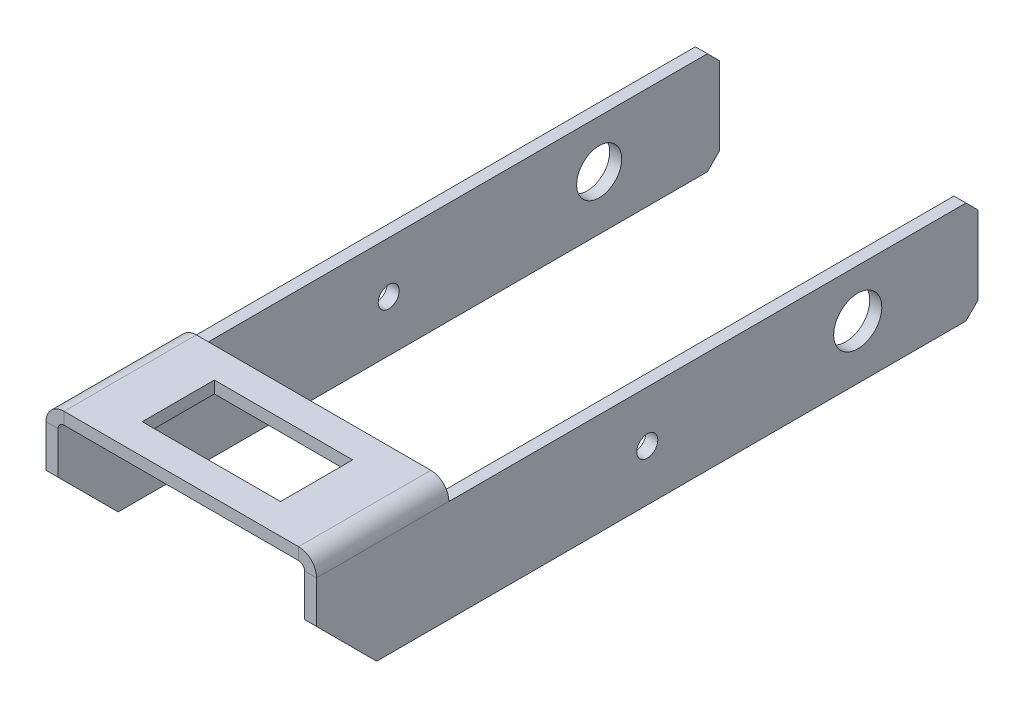
ISO-10303-21;
HEADER;
FILE_DESCRIPTION(('STEP AP214'),'2;1');
FILE_NAME('part.step','',(''),(''),'','','');
FILE_SCHEMA(('AUTOMOTIVE_DESIGN { 1 0 10303 214 1 1 1 1 }'));
ENDSEC;
DATA;
#1=APPLICATION_CONTEXT('core data for automotive mechanical design processes');
#2=APPLICATION_PROTOCOL_DEFINITION('international standard','automotive_design',2000,#1);
#3=PRODUCT_CONTEXT('',#1,'mechanical');
#4=PRODUCT('Part','Part','',(#3));
#5=PRODUCT_RELATED_PRODUCT_CATEGORY('part','',(#4));
#6=PRODUCT_DEFINITION_FORMATION('','',#4);
#7=PRODUCT_DEFINITION_CONTEXT('part definition',#1,'design');
#8=PRODUCT_DEFINITION('design','',#6,#7);
#9=PRODUCT_DEFINITION_SHAPE('','',#8);
#10=(LENGTH_UNIT() NAMED_UNIT(*) SI_UNIT(.MILLI.,.METRE.));
#11=(NAMED_UNIT(*) PLANE_ANGLE_UNIT() SI_UNIT($,.RADIAN.));
#12=(NAMED_UNIT(*) SI_UNIT($,.STERADIAN.) SOLID_ANGLE_UNIT());
#13=UNCERTAINTY_MEASURE_WITH_UNIT(LENGTH_MEASURE(1.E-05),#10,'distance_accuracy_value','');
#14=(GEOMETRIC_REPRESENTATION_CONTEXT(3) GLOBAL_UNCERTAINTY_ASSIGNED_CONTEXT((#13)) GLOBAL_UNIT_ASSIGNED_CONTEXT((#10,
#11,#12)) REPRESENTATION_CONTEXT('',''));
#15=CARTESIAN_POINT('',(0.,0.,0.));
#16=DIRECTION('',(0.,0.,1.));
#17=DIRECTION('',(1.,0.,0.));
#18=AXIS2_PLACEMENT_3D('',#15,#16,#17);
#19=CARTESIAN_POINT('',(0.,2.,0.));
#20=DIRECTION('',(0.,0.,-1.));
#21=DIRECTION('',(-1.,0.,0.));
#22=AXIS2_PLACEMENT_3D('',#19,#20,#21);
#23=PLANE('',#22);
#24=DIRECTION('',(0.,1.,0.));
#25=VECTOR('',#24,1.);
#26=CARTESIAN_POINT('',(3.,0.,0.));
#27=LINE('',#26,#25);
#28=CARTESIAN_POINT('',(3.,0.,0.));
#29=VERTEX_POINT('',#28);
#30=CARTESIAN_POINT('',(3.,2.,0.));
#31=VERTEX_POINT('',#30);
#32=EDGE_CURVE('E338',#29,#31,#27,.T.);
#33=ORIENTED_EDGE('',*,*,#32,.F.);
#34=DIRECTION('',(1.,0.,0.));
#35=VECTOR('',#34,1.);
#36=CARTESIAN_POINT('',(0.,0.,0.));
#37=LINE('',#36,#35);
#38=CARTESIAN_POINT('',(42.,0.,0.));
#39=VERTEX_POINT('',#38);
#40=EDGE_CURVE('E395',#29,#39,#37,.T.);
#41=ORIENTED_EDGE('',*,*,#40,.T.);
#42=DIRECTION('',(0.,1.,0.));
#43=VECTOR('',#42,1.);
#44=CARTESIAN_POINT('',(42.,0.,0.));
#45=LINE('',#44,#43);
#46=CARTESIAN_POINT('',(42.,2.,0.));
#47=VERTEX_POINT('',#46);
#48=EDGE_CURVE('E376',#39,#47,#45,.T.);
#49=ORIENTED_EDGE('',*,*,#48,.T.);
#50=DIRECTION('',(1.,0.,0.));
#51=VECTOR('',#50,1.);
#52=CARTESIAN_POINT('',(0.,2.,0.));
#53=LINE('',#52,#51);
#54=EDGE_CURVE('E397',#31,#47,#53,.T.);
#55=ORIENTED_EDGE('',*,*,#54,.F.);
#56=EDGE_LOOP('',(#33,#41,#49,#55));
#57=FACE_BOUND('',#56,.T.);
#58=ADVANCED_FACE('F79',(#57),#23,.F.);
#59=CARTESIAN_POINT('',(0.,2.,-22.));
#60=DIRECTION('',(0.,0.,1.));
#61=DIRECTION('',(1.,0.,0.));
#62=AXIS2_PLACEMENT_3D('',#59,#60,#61);
#63=PLANE('',#62);
#64=DIRECTION('',(0.,1.,0.));
#65=VECTOR('',#64,1.);
#66=CARTESIAN_POINT('',(3.,0.,-22.));
#67=LINE('',#66,#65);
#68=CARTESIAN_POINT('',(3.,0.,-22.));
#69=VERTEX_POINT('',#68);
#70=CARTESIAN_POINT('',(3.,2.,-22.));
#71=VERTEX_POINT('',#70);
#72=EDGE_CURVE('E324',#69,#71,#67,.T.);
#73=ORIENTED_EDGE('',*,*,#72,.T.);
#74=DIRECTION('',(-1.,0.,0.));
#75=VECTOR('',#74,1.);
#76=CARTESIAN_POINT('',(0.,2.,-22.));
#77=LINE('',#76,#75);
#78=CARTESIAN_POINT('',(42.,2.,-22.));
#79=VERTEX_POINT('',#78);
#80=EDGE_CURVE('E400',#79,#71,#77,.T.);
#81=ORIENTED_EDGE('',*,*,#80,.F.);
#82=DIRECTION('',(0.,1.,0.));
#83=VECTOR('',#82,1.);
#84=CARTESIAN_POINT('',(42.,0.,-22.));
#85=LINE('',#84,#83);
#86=CARTESIAN_POINT('',(42.,0.,-22.));
#87=VERTEX_POINT('',#86);
#88=EDGE_CURVE('E389',#87,#79,#85,.T.);
#89=ORIENTED_EDGE('',*,*,#88,.F.);
#90=DIRECTION('',(-1.,0.,0.));
#91=VECTOR('',#90,1.);
#92=CARTESIAN_POINT('',(0.,0.,-22.));
#93=LINE('',#92,#91);
#94=EDGE_CURVE('E401',#87,#69,#93,.T.);
#95=ORIENTED_EDGE('',*,*,#94,.T.);
#96=EDGE_LOOP('',(#73,#81,#89,#95));
#97=FACE_BOUND('',#96,.T.);
#98=ADVANCED_FACE('F495',(#97),#63,.F.);
#99=CARTESIAN_POINT('',(0.,2.,0.));
#100=DIRECTION('',(0.,-1.,0.));
#101=DIRECTION('',(0.,0.,-1.));
#102=AXIS2_PLACEMENT_3D('',#99,#100,#101);
#103=PLANE('',#102);
#104=DIRECTION('',(-1.,0.,0.));
#105=VECTOR('',#104,1.);
#106=CARTESIAN_POINT('',(11.,2.,-17.));
#107=LINE('',#106,#105);
#108=CARTESIAN_POINT('',(34.,2.,-17.));
#109=VERTEX_POINT('',#108);
#110=CARTESIAN_POINT('',(11.,2.,-17.));
#111=VERTEX_POINT('',#110);
#112=EDGE_CURVE('E257',#109,#111,#107,.T.);
#113=ORIENTED_EDGE('',*,*,#112,.F.);
#114=DIRECTION('',(0.,0.,-1.));
#115=VECTOR('',#114,1.);
#116=CARTESIAN_POINT('',(34.,2.,-5.));
#117=LINE('',#116,#115);
#118=CARTESIAN_POINT('',(34.,2.,-5.));
#119=VERTEX_POINT('',#118);
#120=EDGE_CURVE('E262',#119,#109,#117,.T.);
#121=ORIENTED_EDGE('',*,*,#120,.F.);
#122=DIRECTION('',(1.,0.,0.));
#123=VECTOR('',#122,1.);
#124=CARTESIAN_POINT('',(11.,2.,-5.));
#125=LINE('',#124,#123);
#126=CARTESIAN_POINT('',(11.,2.,-5.));
#127=VERTEX_POINT('',#126);
#128=EDGE_CURVE('E267',#127,#119,#125,.T.);
#129=ORIENTED_EDGE('',*,*,#128,.F.);
#130=DIRECTION('',(0.,0.,1.));
#131=VECTOR('',#130,1.);
#132=CARTESIAN_POINT('',(11.,2.,-5.));
#133=LINE('',#132,#131);
#134=EDGE_CURVE('E246',#111,#127,#133,.T.);
#135=ORIENTED_EDGE('',*,*,#134,.F.);
#136=EDGE_LOOP('',(#113,#121,#129,#135));
#137=FACE_BOUND('',#136,.T.);
#138=DIRECTION('',(0.,0.,-1.));
#139=VECTOR('',#138,1.);
#140=CARTESIAN_POINT('',(3.,2.,-22.));
#141=LINE('',#140,#139);
#142=EDGE_CURVE('E318',#71,#31,#141,.F.);
#143=ORIENTED_EDGE('',*,*,#142,.T.);
#144=ORIENTED_EDGE('',*,*,#54,.T.);
#145=DIRECTION('',(0.,0.,1.));
#146=VECTOR('',#145,1.);
#147=CARTESIAN_POINT('',(42.,2.,0.));
#148=LINE('',#147,#146);
#149=EDGE_CURVE('E371',#47,#79,#148,.F.);
#150=ORIENTED_EDGE('',*,*,#149,.T.);
#151=ORIENTED_EDGE('',*,*,#80,.T.);
#152=EDGE_LOOP('',(#143,#144,#150,#151));
#153=FACE_BOUND('',#152,.T.);
#154=ADVANCED_FACE('F264',(#137,#153),#103,.F.);
#155=CARTESIAN_POINT('',(0.,0.,0.));
#156=DIRECTION('',(0.,-1.,0.));
#157=DIRECTION('',(0.,0.,-1.));
#158=AXIS2_PLACEMENT_3D('',#155,#156,#157);
#159=PLANE('',#158);
#160=DIRECTION('',(0.,0.,1.));
#161=VECTOR('',#160,1.);
#162=CARTESIAN_POINT('',(34.,0.,0.));
#163=LINE('',#162,#161);
#164=CARTESIAN_POINT('',(34.,0.,-17.));
#165=VERTEX_POINT('',#164);
#166=CARTESIAN_POINT('',(34.,0.,-5.));
#167=VERTEX_POINT('',#166);
#168=EDGE_CURVE('E417',#165,#167,#163,.T.);
#169=ORIENTED_EDGE('',*,*,#168,.F.);
#170=DIRECTION('',(1.,0.,0.));
#171=VECTOR('',#170,1.);
#172=CARTESIAN_POINT('',(0.,0.,-17.));
#173=LINE('',#172,#171);
#174=CARTESIAN_POINT('',(11.,0.,-17.));
#175=VERTEX_POINT('',#174);
#176=EDGE_CURVE('E403',#175,#165,#173,.T.);
#177=ORIENTED_EDGE('',*,*,#176,.F.);
#178=DIRECTION('',(0.,0.,-1.));
#179=VECTOR('',#178,1.);
#180=CARTESIAN_POINT('',(11.,0.,0.));
#181=LINE('',#180,#179);
#182=CARTESIAN_POINT('',(11.,0.,-5.));
#183=VERTEX_POINT('',#182);
#184=EDGE_CURVE('E249',#183,#175,#181,.T.);
#185=ORIENTED_EDGE('',*,*,#184,.F.);
#186=DIRECTION('',(-1.,0.,0.));
#187=VECTOR('',#186,1.);
#188=CARTESIAN_POINT('',(0.,0.,-5.));
#189=LINE('',#188,#187);
#190=EDGE_CURVE('E415',#167,#183,#189,.T.);
#191=ORIENTED_EDGE('',*,*,#190,.F.);
#192=EDGE_LOOP('',(#169,#177,#185,#191));
#193=FACE_BOUND('',#192,.T.);
#194=ORIENTED_EDGE('',*,*,#40,.F.);
#195=DIRECTION('',(0.,0.,-1.));
#196=VECTOR('',#195,1.);
#197=CARTESIAN_POINT('',(3.,0.,-22.));
#198=LINE('',#197,#196);
#199=EDGE_CURVE('E333',#69,#29,#198,.F.);
#200=ORIENTED_EDGE('',*,*,#199,.F.);
#201=ORIENTED_EDGE('',*,*,#94,.F.);
#202=DIRECTION('',(0.,0.,1.));
#203=VECTOR('',#202,1.);
#204=CARTESIAN_POINT('',(42.,0.,0.));
#205=LINE('',#204,#203);
#206=EDGE_CURVE('E382',#39,#87,#205,.F.);
#207=ORIENTED_EDGE('',*,*,#206,.F.);
#208=EDGE_LOOP('',(#194,#200,#201,#207));
#209=FACE_BOUND('',#208,.T.);
#210=ADVANCED_FACE('F491',(#193,#209),#159,.T.);
#211=CARTESIAN_POINT('',(42.,-0.999999999999994,-22.));
#212=DIRECTION('',(0.,0.,-1.));
#213=DIRECTION('',(0.,1.,0.));
#214=AXIS2_PLACEMENT_3D('',#211,#212,#213);
#215=PLANE('',#214);
#216=DIRECTION('',(1.,0.,0.));
#217=VECTOR('',#216,1.);
#218=CARTESIAN_POINT('',(43.,-0.999999999999991,-22.));
#219=LINE('',#218,#217);
#220=CARTESIAN_POINT('',(43.,-0.999999999999991,-22.));
#221=VERTEX_POINT('',#220);
#222=CARTESIAN_POINT('',(45.,-0.999999999999983,-22.));
#223=VERTEX_POINT('',#222);
#224=EDGE_CURVE('E392',#221,#223,#219,.T.);
#225=ORIENTED_EDGE('',*,*,#224,.F.);
#226=CARTESIAN_POINT('',(42.,-0.999999999999994,-22.));
#227=DIRECTION('',(0.,0.,1.));
#228=DIRECTION('',(0.,-1.,0.));
#229=AXIS2_PLACEMENT_3D('',#226,#227,#228);
#230=CIRCLE('',#229,1.);
#231=EDGE_CURVE('E379',#87,#221,#230,.F.);
#232=ORIENTED_EDGE('',*,*,#231,.F.);
#233=ORIENTED_EDGE('',*,*,#88,.T.);
#234=CARTESIAN_POINT('',(42.,-0.999999999999994,-22.));
#235=DIRECTION('',(0.,0.,1.));
#236=DIRECTION('',(0.,-1.,0.));
#237=AXIS2_PLACEMENT_3D('',#234,#235,#236);
#238=CIRCLE('',#237,3.);
#239=EDGE_CURVE('E373',#79,#223,#238,.F.);
#240=ORIENTED_EDGE('',*,*,#239,.T.);
#241=EDGE_LOOP('',(#225,#232,#233,#240));
#242=FACE_BOUND('',#241,.T.);
#243=ADVANCED_FACE('F555',(#242),#215,.T.);
#244=CARTESIAN_POINT('',(42.,-0.999999999999999,0.));
#245=DIRECTION('',(0.,0.,-1.));
#246=DIRECTION('',(0.,1.,0.));
#247=AXIS2_PLACEMENT_3D('',#244,#245,#246);
#248=PLANE('',#247);
#249=CARTESIAN_POINT('',(42.,-0.999999999999999,0.));
#250=DIRECTION('',(0.,0.,1.));
#251=DIRECTION('',(0.,-1.,0.));
#252=AXIS2_PLACEMENT_3D('',#249,#250,#251);
#253=CIRCLE('',#252,1.);
#254=CARTESIAN_POINT('',(43.,-0.999999999999995,0.));
#255=VERTEX_POINT('',#254);
#256=EDGE_CURVE('E385',#255,#39,#253,.T.);
#257=ORIENTED_EDGE('',*,*,#256,.F.);
#258=DIRECTION('',(-1.,0.,0.));
#259=VECTOR('',#258,1.);
#260=CARTESIAN_POINT('',(43.,-0.999999999999994,0.));
#261=LINE('',#260,#259);
#262=CARTESIAN_POINT('',(45.,-0.999999999999989,0.));
#263=VERTEX_POINT('',#262);
#264=EDGE_CURVE('E368',#255,#263,#261,.F.);
#265=ORIENTED_EDGE('',*,*,#264,.T.);
#266=CARTESIAN_POINT('',(42.,-0.999999999999999,0.));
#267=DIRECTION('',(0.,0.,1.));
#268=DIRECTION('',(0.,-1.,0.));
#269=AXIS2_PLACEMENT_3D('',#266,#267,#268);
#270=CIRCLE('',#269,3.);
#271=EDGE_CURVE('E374',#263,#47,#270,.T.);
#272=ORIENTED_EDGE('',*,*,#271,.T.);
#273=ORIENTED_EDGE('',*,*,#48,.F.);
#274=EDGE_LOOP('',(#257,#265,#272,#273));
#275=FACE_BOUND('',#274,.T.);
#276=ADVANCED_FACE('F509',(#275),#248,.F.);
#277=CARTESIAN_POINT('',(42.,-0.999999999999999,0.));
#278=DIRECTION('',(0.,0.,1.));
#279=DIRECTION('',(1.,0.,0.));
#280=AXIS2_PLACEMENT_3D('',#277,#278,#279);
#281=CYLINDRICAL_SURFACE('',#280,3.);
#282=ORIENTED_EDGE('',*,*,#149,.F.);
#283=ORIENTED_EDGE('',*,*,#271,.F.);
#284=DIRECTION('',(0.,0.,1.));
#285=VECTOR('',#284,1.);
#286=CARTESIAN_POINT('',(45.,-0.999999999999966,-110.));
#287=LINE('',#286,#285);
#288=EDGE_CURVE('E364',#263,#223,#287,.F.);
#289=ORIENTED_EDGE('',*,*,#288,.T.);
#290=ORIENTED_EDGE('',*,*,#239,.F.);
#291=EDGE_LOOP('',(#282,#283,#289,#290));
#292=FACE_BOUND('',#291,.T.);
#293=ADVANCED_FACE('F558',(#292),#281,.T.);
#294=CARTESIAN_POINT('',(42.,-0.999999999999999,0.));
#295=DIRECTION('',(0.,0.,1.));
#296=DIRECTION('',(1.,0.,0.));
#297=AXIS2_PLACEMENT_3D('',#294,#295,#296);
#298=CYLINDRICAL_SURFACE('',#297,1.);
#299=ORIENTED_EDGE('',*,*,#206,.T.);
#300=ORIENTED_EDGE('',*,*,#231,.T.);
#301=DIRECTION('',(0.,0.,1.));
#302=VECTOR('',#301,1.);
#303=CARTESIAN_POINT('',(43.,-0.999999999999995,0.));
#304=LINE('',#303,#302);
#305=EDGE_CURVE('E350',#221,#255,#304,.T.);
#306=ORIENTED_EDGE('',*,*,#305,.T.);
#307=ORIENTED_EDGE('',*,*,#256,.T.);
#308=EDGE_LOOP('',(#299,#300,#306,#307));
#309=FACE_BOUND('',#308,.T.);
#310=ADVANCED_FACE('F513',(#309),#298,.F.);
#311=CARTESIAN_POINT('',(45.0000000000001,-18.,0.));
#312=DIRECTION('',(0.,0.,-1.));
#313=DIRECTION('',(-1.,0.,0.));
#314=AXIS2_PLACEMENT_3D('',#311,#312,#313);
#315=PLANE('',#314);
#316=DIRECTION('',(0.,1.,0.));
#317=VECTOR('',#316,1.);
#318=CARTESIAN_POINT('',(43.0000000000001,-18.,0.));
#319=LINE('',#318,#317);
#320=CARTESIAN_POINT('',(43.,-7.99999999999997,0.));
#321=VERTEX_POINT('',#320);
#322=EDGE_CURVE('E361',#255,#321,#319,.F.);
#323=ORIENTED_EDGE('',*,*,#322,.T.);
#324=DIRECTION('',(1.,0.,0.));
#325=VECTOR('',#324,1.);
#326=CARTESIAN_POINT('',(45.,-7.99999999999996,0.));
#327=LINE('',#326,#325);
#328=CARTESIAN_POINT('',(45.,-7.99999999999996,0.));
#329=VERTEX_POINT('',#328);
#330=EDGE_CURVE('E462',#321,#329,#327,.T.);
#331=ORIENTED_EDGE('',*,*,#330,.T.);
#332=DIRECTION('',(0.,-1.,0.));
#333=VECTOR('',#332,1.);
#334=CARTESIAN_POINT('',(45.,1.63108075515599E-13,0.));
#335=LINE('',#334,#333);
#336=EDGE_CURVE('E353',#263,#329,#335,.T.);
#337=ORIENTED_EDGE('',*,*,#336,.F.);
#338=ORIENTED_EDGE('',*,*,#264,.F.);
#339=EDGE_LOOP('',(#323,#331,#337,#338));
#340=FACE_BOUND('',#339,.T.);
#341=ADVANCED_FACE('F524',(#340),#315,.F.);
#342=CARTESIAN_POINT('',(45.,0.,-110.));
#343=DIRECTION('',(0.,0.,1.));
#344=DIRECTION('',(1.,0.,0.));
#345=AXIS2_PLACEMENT_3D('',#342,#343,#344);
#346=PLANE('',#345);
#347=DIRECTION('',(0.,1.,0.));
#348=VECTOR('',#347,1.);
#349=CARTESIAN_POINT('',(45.,1.63108075515599E-13,-110.));
#350=LINE('',#349,#348);
#351=CARTESIAN_POINT('',(45.0000000000001,-16.,-110.));
#352=VERTEX_POINT('',#351);
#353=CARTESIAN_POINT('',(45.,-2.99999999999995,-110.));
#354=VERTEX_POINT('',#353);
#355=EDGE_CURVE('E347',#352,#354,#350,.T.);
#356=ORIENTED_EDGE('',*,*,#355,.F.);
#357=DIRECTION('',(-1.,0.,0.));
#358=VECTOR('',#357,1.);
#359=CARTESIAN_POINT('',(45.0000000000001,-16.,-110.));
#360=LINE('',#359,#358);
#361=CARTESIAN_POINT('',(43.,-16.,-110.));
#362=VERTEX_POINT('',#361);
#363=EDGE_CURVE('E440',#352,#362,#360,.T.);
#364=ORIENTED_EDGE('',*,*,#363,.T.);
#365=DIRECTION('',(0.,-1.,0.));
#366=VECTOR('',#365,1.);
#367=CARTESIAN_POINT('',(43.,0.,-110.));
#368=LINE('',#367,#366);
#369=CARTESIAN_POINT('',(43.,-2.99999999999996,-110.));
#370=VERTEX_POINT('',#369);
#371=EDGE_CURVE('E356',#362,#370,#368,.F.);
#372=ORIENTED_EDGE('',*,*,#371,.T.);
#373=DIRECTION('',(1.,0.,0.));
#374=VECTOR('',#373,1.);
#375=CARTESIAN_POINT('',(45.,-2.99999999999995,-110.));
#376=LINE('',#375,#374);
#377=EDGE_CURVE('E437',#370,#354,#376,.T.);
#378=ORIENTED_EDGE('',*,*,#377,.T.);
#379=EDGE_LOOP('',(#356,#364,#372,#378));
#380=FACE_BOUND('',#379,.T.);
#381=ADVANCED_FACE('F543',(#380),#346,.F.);
#382=CARTESIAN_POINT('',(45.,1.63108075515599E-13,0.));
#383=DIRECTION('',(-1.,0.,0.));
#384=DIRECTION('',(0.,-1.,0.));
#385=AXIS2_PLACEMENT_3D('',#382,#383,#384);
#386=PLANE('',#385);
#387=CARTESIAN_POINT('',(45.0000000000001,-9.50000000000017,-55.));
#388=DIRECTION('',(-1.,0.,0.));
#389=DIRECTION('',(0.,-1.,0.));
#390=AXIS2_PLACEMENT_3D('',#387,#388,#389);
#391=CIRCLE('',#390,1.75);
#392=CARTESIAN_POINT('',(45.0000000000001,-11.2500000000002,-55.));
#393=VERTEX_POINT('',#392);
#394=EDGE_CURVE('E277',#393,#393,#391,.T.);
#395=ORIENTED_EDGE('',*,*,#394,.T.);
#396=EDGE_LOOP('',(#395));
#397=FACE_BOUND('',#396,.T.);
#398=CARTESIAN_POINT('',(45.,-8.99999999999984,-90.));
#399=DIRECTION('',(1.,0.,0.));
#400=DIRECTION('',(0.,1.,0.));
#401=AXIS2_PLACEMENT_3D('',#398,#399,#400);
#402=CIRCLE('',#401,4.00000000000001);
#403=CARTESIAN_POINT('',(45.,-4.99999999999984,-90.));
#404=VERTEX_POINT('',#403);
#405=EDGE_CURVE('E290',#404,#404,#402,.T.);
#406=ORIENTED_EDGE('',*,*,#405,.F.);
#407=EDGE_LOOP('',(#406));
#408=FACE_BOUND('',#407,.T.);
#409=ORIENTED_EDGE('',*,*,#336,.T.);
#410=DIRECTION('',(0.,0.707106781186549,0.707106781186546));
#411=VECTOR('',#410,1.);
#412=CARTESIAN_POINT('',(45.0000000000001,-18.,-10.));
#413=LINE('',#412,#411);
#414=CARTESIAN_POINT('',(45.0000000000001,-18.,-10.));
#415=VERTEX_POINT('',#414);
#416=EDGE_CURVE('E464',#329,#415,#413,.F.);
#417=ORIENTED_EDGE('',*,*,#416,.T.);
#418=DIRECTION('',(0.,0.,-1.));
#419=VECTOR('',#418,1.);
#420=CARTESIAN_POINT('',(45.0000000000001,-18.,0.));
#421=LINE('',#420,#419);
#422=CARTESIAN_POINT('',(45.0000000000001,-18.,-108.));
#423=VERTEX_POINT('',#422);
#424=EDGE_CURVE('E351',#415,#423,#421,.T.);
#425=ORIENTED_EDGE('',*,*,#424,.T.);
#426=DIRECTION('',(0.,-0.707106781186545,0.70710678118655));
#427=VECTOR('',#426,1.);
#428=CARTESIAN_POINT('',(45.0000000000001,-16.,-110.));
#429=LINE('',#428,#427);
#430=EDGE_CURVE('E453',#423,#352,#429,.F.);
#431=ORIENTED_EDGE('',*,*,#430,.T.);
#432=ORIENTED_EDGE('',*,*,#355,.T.);
#433=DIRECTION('',(0.,0.707106781186545,0.70710678118655));
#434=VECTOR('',#433,1.);
#435=CARTESIAN_POINT('',(45.,-2.99999999999995,-110.));
#436=LINE('',#435,#434);
#437=CARTESIAN_POINT('',(45.,-0.999999999999967,-108.));
#438=VERTEX_POINT('',#437);
#439=EDGE_CURVE('E451',#354,#438,#436,.T.);
#440=ORIENTED_EDGE('',*,*,#439,.T.);
#441=EDGE_CURVE('E367',#223,#438,#287,.F.);
#442=ORIENTED_EDGE('',*,*,#441,.F.);
#443=ORIENTED_EDGE('',*,*,#288,.F.);
#444=EDGE_LOOP('',(#409,#417,#425,#431,#432,#440,#442,#443));
#445=FACE_BOUND('',#444,.T.);
#446=ADVANCED_FACE('F532',(#397,#408,#445),#386,.F.);
#447=CARTESIAN_POINT('',(43.,1.56125112837912E-13,0.));
#448=DIRECTION('',(-1.,0.,0.));
#449=DIRECTION('',(0.,-1.,0.));
#450=AXIS2_PLACEMENT_3D('',#447,#448,#449);
#451=PLANE('',#450);
#452=CARTESIAN_POINT('',(43.,-9.50000000000016,-55.));
#453=DIRECTION('',(-1.,0.,0.));
#454=DIRECTION('',(0.,-1.,0.));
#455=AXIS2_PLACEMENT_3D('',#452,#453,#454);
#456=CIRCLE('',#455,1.75);
#457=CARTESIAN_POINT('',(43.,-11.2500000000002,-55.));
#458=VERTEX_POINT('',#457);
#459=EDGE_CURVE('E283',#458,#458,#456,.T.);
#460=ORIENTED_EDGE('',*,*,#459,.F.);
#461=EDGE_LOOP('',(#460));
#462=FACE_BOUND('',#461,.T.);
#463=CARTESIAN_POINT('',(43.,-8.99999999999985,-90.));
#464=DIRECTION('',(-1.,0.,0.));
#465=DIRECTION('',(0.,-1.,0.));
#466=AXIS2_PLACEMENT_3D('',#463,#464,#465);
#467=CIRCLE('',#466,4.00000000000001);
#468=CARTESIAN_POINT('',(43.,-12.9999999999999,-90.));
#469=VERTEX_POINT('',#468);
#470=EDGE_CURVE('E293',#469,#469,#467,.T.);
#471=ORIENTED_EDGE('',*,*,#470,.F.);
#472=EDGE_LOOP('',(#471));
#473=FACE_BOUND('',#472,.T.);
#474=DIRECTION('',(0.,0.,1.));
#475=VECTOR('',#474,1.);
#476=CARTESIAN_POINT('',(43.0000000000001,-18.,-110.));
#477=LINE('',#476,#475);
#478=CARTESIAN_POINT('',(43.0000000000001,-18.,-10.));
#479=VERTEX_POINT('',#478);
#480=CARTESIAN_POINT('',(43.0000000000001,-18.,-108.));
#481=VERTEX_POINT('',#480);
#482=EDGE_CURVE('E359',#479,#481,#477,.F.);
#483=ORIENTED_EDGE('',*,*,#482,.F.);
#484=DIRECTION('',(0.,-0.707106781186549,-0.707106781186546));
#485=VECTOR('',#484,1.);
#486=CARTESIAN_POINT('',(43.,-3.99999999999989,4.00000000000006));
#487=LINE('',#486,#485);
#488=EDGE_CURVE('E460',#479,#321,#487,.F.);
#489=ORIENTED_EDGE('',*,*,#488,.T.);
#490=ORIENTED_EDGE('',*,*,#322,.F.);
#491=ORIENTED_EDGE('',*,*,#305,.F.);
#492=DIRECTION('',(0.,0.,1.));
#493=VECTOR('',#492,1.);
#494=CARTESIAN_POINT('',(43.,-0.999999999999973,-110.));
#495=LINE('',#494,#493);
#496=CARTESIAN_POINT('',(43.,-0.999999999999974,-108.));
#497=VERTEX_POINT('',#496);
#498=EDGE_CURVE('E344',#497,#221,#495,.T.);
#499=ORIENTED_EDGE('',*,*,#498,.F.);
#500=DIRECTION('',(0.,-0.707106781186545,-0.70710678118655));
#501=VECTOR('',#500,1.);
#502=CARTESIAN_POINT('',(42.9999999999998,53.5000000000001,-53.4999999999996));
#503=LINE('',#502,#501);
#504=EDGE_CURVE('E443',#497,#370,#503,.T.);
#505=ORIENTED_EDGE('',*,*,#504,.T.);
#506=ORIENTED_EDGE('',*,*,#371,.F.);
#507=DIRECTION('',(0.,0.707106781186545,-0.70710678118655));
#508=VECTOR('',#507,1.);
#509=CARTESIAN_POINT('',(43.0000000000002,-63.,-62.9999999999997));
#510=LINE('',#509,#508);
#511=EDGE_CURVE('E445',#362,#481,#510,.F.);
#512=ORIENTED_EDGE('',*,*,#511,.T.);
#513=EDGE_LOOP('',(#483,#489,#490,#491,#499,#505,#506,#512));
#514=FACE_BOUND('',#513,.T.);
#515=ADVANCED_FACE('F520',(#462,#473,#514),#451,.T.);
#516=CARTESIAN_POINT('',(45.0000000000001,-18.,-110.));
#517=DIRECTION('',(0.,1.,0.));
#518=DIRECTION('',(-1.,0.,0.));
#519=AXIS2_PLACEMENT_3D('',#516,#517,#518);
#520=PLANE('',#519);
#521=ORIENTED_EDGE('',*,*,#424,.F.);
#522=DIRECTION('',(-1.,0.,0.));
#523=VECTOR('',#522,1.);
#524=CARTESIAN_POINT('',(45.0000000000001,-18.,-10.));
#525=LINE('',#524,#523);
#526=EDGE_CURVE('E457',#415,#479,#525,.T.);
#527=ORIENTED_EDGE('',*,*,#526,.T.);
#528=ORIENTED_EDGE('',*,*,#482,.T.);
#529=DIRECTION('',(1.,0.,0.));
#530=VECTOR('',#529,1.);
#531=CARTESIAN_POINT('',(45.0000000000001,-18.,-108.));
#532=LINE('',#531,#530);
#533=EDGE_CURVE('E448',#481,#423,#532,.T.);
#534=ORIENTED_EDGE('',*,*,#533,.T.);
#535=EDGE_LOOP('',(#521,#527,#528,#534));
#536=FACE_BOUND('',#535,.T.);
#537=ADVANCED_FACE('F535',(#536),#520,.F.);
#538=CARTESIAN_POINT('',(43.,-0.999999999999973,-110.));
#539=DIRECTION('',(0.,1.,0.));
#540=DIRECTION('',(-1.,0.,0.));
#541=AXIS2_PLACEMENT_3D('',#538,#539,#540);
#542=PLANE('',#541);
#543=ORIENTED_EDGE('',*,*,#441,.T.);
#544=DIRECTION('',(-1.,0.,0.));
#545=VECTOR('',#544,1.);
#546=CARTESIAN_POINT('',(43.,-0.999999999999974,-108.));
#547=LINE('',#546,#545);
#548=EDGE_CURVE('E455',#438,#497,#547,.T.);
#549=ORIENTED_EDGE('',*,*,#548,.T.);
#550=ORIENTED_EDGE('',*,*,#498,.T.);
#551=ORIENTED_EDGE('',*,*,#224,.T.);
#552=EDGE_LOOP('',(#543,#549,#550,#551));
#553=FACE_BOUND('',#552,.T.);
#554=ADVANCED_FACE('F552',(#553),#542,.T.);
#555=CARTESIAN_POINT('',(3.,-0.999999999999996,0.));
#556=DIRECTION('',(0.,0.,1.));
#557=DIRECTION('',(0.,-1.,0.));
#558=AXIS2_PLACEMENT_3D('',#555,#556,#557);
#559=PLANE('',#558);
#560=DIRECTION('',(1.,0.,0.));
#561=VECTOR('',#560,1.);
#562=CARTESIAN_POINT('',(0.,-0.99999999999999,0.));
#563=LINE('',#562,#561);
#564=CARTESIAN_POINT('',(2.,-0.999999999999997,0.));
#565=VERTEX_POINT('',#564);
#566=CARTESIAN_POINT('',(0.,-0.99999999999999,0.));
#567=VERTEX_POINT('',#566);
#568=EDGE_CURVE('E315',#565,#567,#563,.F.);
#569=ORIENTED_EDGE('',*,*,#568,.F.);
#570=CARTESIAN_POINT('',(3.,-0.999999999999996,0.));
#571=DIRECTION('',(0.,0.,-1.));
#572=DIRECTION('',(0.,1.,0.));
#573=AXIS2_PLACEMENT_3D('',#570,#571,#572);
#574=CIRCLE('',#573,1.);
#575=EDGE_CURVE('E328',#29,#565,#574,.F.);
#576=ORIENTED_EDGE('',*,*,#575,.F.);
#577=ORIENTED_EDGE('',*,*,#32,.T.);
#578=CARTESIAN_POINT('',(3.,-0.999999999999996,0.));
#579=DIRECTION('',(0.,0.,-1.));
#580=DIRECTION('',(0.,1.,0.));
#581=AXIS2_PLACEMENT_3D('',#578,#579,#580);
#582=CIRCLE('',#581,3.);
#583=EDGE_CURVE('E320',#31,#567,#582,.F.);
#584=ORIENTED_EDGE('',*,*,#583,.T.);
#585=EDGE_LOOP('',(#569,#576,#577,#584));
#586=FACE_BOUND('',#585,.T.);
#587=ADVANCED_FACE('F484',(#586),#559,.T.);
#588=CARTESIAN_POINT('',(3.,-1.,-22.));
#589=DIRECTION('',(0.,0.,1.));
#590=DIRECTION('',(0.,-1.,0.));
#591=AXIS2_PLACEMENT_3D('',#588,#589,#590);
#592=PLANE('',#591);
#593=CARTESIAN_POINT('',(3.,-1.,-22.));
#594=DIRECTION('',(0.,0.,-1.));
#595=DIRECTION('',(0.,1.,0.));
#596=AXIS2_PLACEMENT_3D('',#593,#594,#595);
#597=CIRCLE('',#596,1.);
#598=CARTESIAN_POINT('',(2.,-1.,-22.));
#599=VERTEX_POINT('',#598);
#600=EDGE_CURVE('E296',#599,#69,#597,.T.);
#601=ORIENTED_EDGE('',*,*,#600,.F.);
#602=DIRECTION('',(-1.,0.,0.));
#603=VECTOR('',#602,1.);
#604=CARTESIAN_POINT('',(2.,-0.999999999999997,-22.));
#605=LINE('',#604,#603);
#606=CARTESIAN_POINT('',(0.,-0.99999999999999,-22.));
#607=VERTEX_POINT('',#606);
#608=EDGE_CURVE('E341',#599,#607,#605,.T.);
#609=ORIENTED_EDGE('',*,*,#608,.T.);
#610=CARTESIAN_POINT('',(3.,-1.,-22.));
#611=DIRECTION('',(0.,0.,-1.));
#612=DIRECTION('',(0.,1.,0.));
#613=AXIS2_PLACEMENT_3D('',#610,#611,#612);
#614=CIRCLE('',#613,3.);
#615=EDGE_CURVE('E321',#607,#71,#614,.T.);
#616=ORIENTED_EDGE('',*,*,#615,.T.);
#617=ORIENTED_EDGE('',*,*,#72,.F.);
#618=EDGE_LOOP('',(#601,#609,#616,#617));
#619=FACE_BOUND('',#618,.T.);
#620=ADVANCED_FACE('F499',(#619),#592,.F.);
#621=CARTESIAN_POINT('',(3.,-1.,-22.));
#622=DIRECTION('',(0.,0.,-1.));
#623=DIRECTION('',(-1.,0.,0.));
#624=AXIS2_PLACEMENT_3D('',#621,#622,#623);
#625=CYLINDRICAL_SURFACE('',#624,3.);
#626=ORIENTED_EDGE('',*,*,#142,.F.);
#627=ORIENTED_EDGE('',*,*,#615,.F.);
#628=DIRECTION('',(0.,0.,-1.));
#629=VECTOR('',#628,1.);
#630=CARTESIAN_POINT('',(0.,-0.99999999999999,-22.));
#631=LINE('',#630,#629);
#632=EDGE_CURVE('E325',#567,#607,#631,.T.);
#633=ORIENTED_EDGE('',*,*,#632,.F.);
#634=ORIENTED_EDGE('',*,*,#583,.F.);
#635=EDGE_LOOP('',(#626,#627,#633,#634));
#636=FACE_BOUND('',#635,.T.);
#637=ADVANCED_FACE('F502',(#636),#625,.T.);
#638=CARTESIAN_POINT('',(3.,-1.,-22.));
#639=DIRECTION('',(0.,0.,-1.));
#640=DIRECTION('',(-1.,0.,0.));
#641=AXIS2_PLACEMENT_3D('',#638,#639,#640);
#642=CYLINDRICAL_SURFACE('',#641,1.);
#643=ORIENTED_EDGE('',*,*,#199,.T.);
#644=ORIENTED_EDGE('',*,*,#575,.T.);
#645=DIRECTION('',(0.,0.,-1.));
#646=VECTOR('',#645,1.);
#647=CARTESIAN_POINT('',(2.,-0.999999999999997,0.));
#648=LINE('',#647,#646);
#649=EDGE_CURVE('E311',#565,#599,#648,.T.);
#650=ORIENTED_EDGE('',*,*,#649,.T.);
#651=ORIENTED_EDGE('',*,*,#600,.T.);
#652=EDGE_LOOP('',(#643,#644,#650,#651));
#653=FACE_BOUND('',#652,.T.);
#654=ADVANCED_FACE('F487',(#653),#642,.F.);
#655=CARTESIAN_POINT('',(2.,-0.999999999999997,0.));
#656=DIRECTION('',(0.,1.,0.));
#657=DIRECTION('',(-1.,0.,0.));
#658=AXIS2_PLACEMENT_3D('',#655,#656,#657);
#659=PLANE('',#658);
#660=CARTESIAN_POINT('',(2.,-1.00000000000001,-108.));
#661=VERTEX_POINT('',#660);
#662=EDGE_CURVE('E314',#599,#661,#648,.T.);
#663=ORIENTED_EDGE('',*,*,#662,.T.);
#664=DIRECTION('',(-1.,0.,0.));
#665=VECTOR('',#664,1.);
#666=CARTESIAN_POINT('',(0.,-1.00000000000001,-108.));
#667=LINE('',#666,#665);
#668=CARTESIAN_POINT('',(0.,-1.00000000000001,-108.));
#669=VERTEX_POINT('',#668);
#670=EDGE_CURVE('E419',#661,#669,#667,.T.);
#671=ORIENTED_EDGE('',*,*,#670,.T.);
#672=DIRECTION('',(0.,0.,-1.));
#673=VECTOR('',#672,1.);
#674=CARTESIAN_POINT('',(0.,-0.99999999999999,0.));
#675=LINE('',#674,#673);
#676=EDGE_CURVE('E309',#669,#607,#675,.F.);
#677=ORIENTED_EDGE('',*,*,#676,.T.);
#678=ORIENTED_EDGE('',*,*,#608,.F.);
#679=EDGE_LOOP('',(#663,#671,#677,#678));
#680=FACE_BOUND('',#679,.T.);
#681=ADVANCED_FACE('F622',(#680),#659,.T.);
#682=CARTESIAN_POINT('',(0.,-18.,-110.));
#683=DIRECTION('',(0.,0.,1.));
#684=DIRECTION('',(1.,0.,0.));
#685=AXIS2_PLACEMENT_3D('',#682,#683,#684);
#686=PLANE('',#685);
#687=DIRECTION('',(0.,-1.,0.));
#688=VECTOR('',#687,1.);
#689=CARTESIAN_POINT('',(0.,0.,-110.));
#690=LINE('',#689,#688);
#691=CARTESIAN_POINT('',(0.,-2.99999999999998,-110.));
#692=VERTEX_POINT('',#691);
#693=CARTESIAN_POINT('',(0.,-16.,-110.));
#694=VERTEX_POINT('',#693);
#695=EDGE_CURVE('E299',#692,#694,#690,.T.);
#696=ORIENTED_EDGE('',*,*,#695,.F.);
#697=DIRECTION('',(1.,0.,0.));
#698=VECTOR('',#697,1.);
#699=CARTESIAN_POINT('',(1.99999999999999,-2.99999999999999,-110.));
#700=LINE('',#699,#698);
#701=CARTESIAN_POINT('',(1.99999999999999,-2.99999999999999,-110.));
#702=VERTEX_POINT('',#701);
#703=EDGE_CURVE('E428',#692,#702,#700,.T.);
#704=ORIENTED_EDGE('',*,*,#703,.T.);
#705=DIRECTION('',(0.,1.,0.));
#706=VECTOR('',#705,1.);
#707=CARTESIAN_POINT('',(1.99999999999994,-18.,-110.));
#708=LINE('',#707,#706);
#709=CARTESIAN_POINT('',(1.99999999999994,-16.,-110.));
#710=VERTEX_POINT('',#709);
#711=EDGE_CURVE('E306',#702,#710,#708,.F.);
#712=ORIENTED_EDGE('',*,*,#711,.T.);
#713=DIRECTION('',(-1.,0.,0.));
#714=VECTOR('',#713,1.);
#715=CARTESIAN_POINT('',(0.,-16.,-110.));
#716=LINE('',#715,#714);
#717=EDGE_CURVE('E426',#710,#694,#716,.T.);
#718=ORIENTED_EDGE('',*,*,#717,.T.);
#719=EDGE_LOOP('',(#696,#704,#712,#718));
#720=FACE_BOUND('',#719,.T.);
#721=ADVANCED_FACE('F618',(#720),#686,.F.);
#722=CARTESIAN_POINT('',(0.,0.,0.));
#723=DIRECTION('',(0.,0.,-1.));
#724=DIRECTION('',(-1.,0.,0.));
#725=AXIS2_PLACEMENT_3D('',#722,#723,#724);
#726=PLANE('',#725);
#727=DIRECTION('',(0.,1.,0.));
#728=VECTOR('',#727,1.);
#729=CARTESIAN_POINT('',(0.,0.,0.));
#730=LINE('',#729,#728);
#731=CARTESIAN_POINT('',(0.,-8.00000000000001,0.));
#732=VERTEX_POINT('',#731);
#733=EDGE_CURVE('E294',#732,#567,#730,.T.);
#734=ORIENTED_EDGE('',*,*,#733,.F.);
#735=DIRECTION('',(1.,0.,0.));
#736=VECTOR('',#735,1.);
#737=CARTESIAN_POINT('',(0.,-8.00000000000001,0.));
#738=LINE('',#737,#736);
#739=CARTESIAN_POINT('',(1.99999999999997,-8.00000000000002,0.));
#740=VERTEX_POINT('',#739);
#741=EDGE_CURVE('E466',#732,#740,#738,.T.);
#742=ORIENTED_EDGE('',*,*,#741,.T.);
#743=DIRECTION('',(0.,-1.,0.));
#744=VECTOR('',#743,1.);
#745=CARTESIAN_POINT('',(2.,0.,0.));
#746=LINE('',#745,#744);
#747=EDGE_CURVE('E302',#740,#565,#746,.F.);
#748=ORIENTED_EDGE('',*,*,#747,.T.);
#749=ORIENTED_EDGE('',*,*,#568,.T.);
#750=EDGE_LOOP('',(#734,#742,#748,#749));
#751=FACE_BOUND('',#750,.T.);
#752=ADVANCED_FACE('F472',(#751),#726,.F.);
#753=CARTESIAN_POINT('',(0.,0.,0.));
#754=DIRECTION('',(1.,0.,0.));
#755=DIRECTION('',(0.,1.,0.));
#756=AXIS2_PLACEMENT_3D('',#753,#754,#755);
#757=PLANE('',#756);
#758=CARTESIAN_POINT('',(0.,-9.50000000000001,-55.));
#759=DIRECTION('',(-1.,0.,0.));
#760=DIRECTION('',(0.,-1.,0.));
#761=AXIS2_PLACEMENT_3D('',#758,#759,#760);
#762=CIRCLE('',#761,1.75);
#763=CARTESIAN_POINT('',(0.,-11.25,-55.));
#764=VERTEX_POINT('',#763);
#765=EDGE_CURVE('E274',#764,#764,#762,.T.);
#766=ORIENTED_EDGE('',*,*,#765,.F.);
#767=EDGE_LOOP('',(#766));
#768=FACE_BOUND('',#767,.T.);
#769=CARTESIAN_POINT('',(0.,-8.99999999999986,-90.));
#770=DIRECTION('',(-1.,0.,0.));
#771=DIRECTION('',(0.,-1.,0.));
#772=AXIS2_PLACEMENT_3D('',#769,#770,#771);
#773=CIRCLE('',#772,3.75000000000001);
#774=CARTESIAN_POINT('',(0.,-12.7499999999999,-90.));
#775=VERTEX_POINT('',#774);
#776=EDGE_CURVE('E286',#775,#775,#773,.T.);
#777=ORIENTED_EDGE('',*,*,#776,.F.);
#778=EDGE_LOOP('',(#777));
#779=FACE_BOUND('',#778,.T.);
#780=DIRECTION('',(0.,0.,1.));
#781=VECTOR('',#780,1.);
#782=CARTESIAN_POINT('',(0.,-18.,0.));
#783=LINE('',#782,#781);
#784=CARTESIAN_POINT('',(0.,-18.,-108.));
#785=VERTEX_POINT('',#784);
#786=CARTESIAN_POINT('',(0.,-18.,-10.));
#787=VERTEX_POINT('',#786);
#788=EDGE_CURVE('E297',#785,#787,#783,.T.);
#789=ORIENTED_EDGE('',*,*,#788,.T.);
#790=DIRECTION('',(0.,-0.707106781186546,-0.707106781186549));
#791=VECTOR('',#790,1.);
#792=CARTESIAN_POINT('',(0.,-8.00000000000001,0.));
#793=LINE('',#792,#791);
#794=EDGE_CURVE('E13',#787,#732,#793,.F.);
#795=ORIENTED_EDGE('',*,*,#794,.T.);
#796=ORIENTED_EDGE('',*,*,#733,.T.);
#797=ORIENTED_EDGE('',*,*,#632,.T.);
#798=ORIENTED_EDGE('',*,*,#676,.F.);
#799=DIRECTION('',(0.,-0.70710678118655,-0.707106781186545));
#800=VECTOR('',#799,1.);
#801=CARTESIAN_POINT('',(0.,-1.00000000000001,-108.));
#802=LINE('',#801,#800);
#803=EDGE_CURVE('E424',#669,#692,#802,.T.);
#804=ORIENTED_EDGE('',*,*,#803,.T.);
#805=ORIENTED_EDGE('',*,*,#695,.T.);
#806=DIRECTION('',(0.,0.70710678118655,-0.707106781186545));
#807=VECTOR('',#806,1.);
#808=CARTESIAN_POINT('',(0.,-18.,-108.));
#809=LINE('',#808,#807);
#810=EDGE_CURVE('E422',#694,#785,#809,.F.);
#811=ORIENTED_EDGE('',*,*,#810,.T.);
#812=EDGE_LOOP('',(#789,#795,#796,#797,#798,#804,#805,#811));
#813=FACE_BOUND('',#812,.T.);
#814=ADVANCED_FACE('F609',(#768,#779,#813),#757,.F.);
#815=CARTESIAN_POINT('',(2.,0.,0.));
#816=DIRECTION('',(1.,0.,0.));
#817=DIRECTION('',(0.,1.,0.));
#818=AXIS2_PLACEMENT_3D('',#815,#816,#817);
#819=PLANE('',#818);
#820=CARTESIAN_POINT('',(1.99999999999997,-9.50000000000002,-55.));
#821=DIRECTION('',(1.,0.,0.));
#822=DIRECTION('',(0.,1.,0.));
#823=AXIS2_PLACEMENT_3D('',#820,#821,#822);
#824=CIRCLE('',#823,1.75);
#825=CARTESIAN_POINT('',(1.99999999999997,-7.75000000000001,-55.));
#826=VERTEX_POINT('',#825);
#827=EDGE_CURVE('E280',#826,#826,#824,.T.);
#828=ORIENTED_EDGE('',*,*,#827,.F.);
#829=EDGE_LOOP('',(#828));
#830=FACE_BOUND('',#829,.T.);
#831=CARTESIAN_POINT('',(1.99999999999997,-8.99999999999986,-90.));
#832=DIRECTION('',(1.,0.,0.));
#833=DIRECTION('',(0.,1.,0.));
#834=AXIS2_PLACEMENT_3D('',#831,#832,#833);
#835=CIRCLE('',#834,3.75000000000001);
#836=CARTESIAN_POINT('',(1.99999999999998,-5.24999999999986,-90.));
#837=VERTEX_POINT('',#836);
#838=EDGE_CURVE('E289',#837,#837,#835,.T.);
#839=ORIENTED_EDGE('',*,*,#838,.F.);
#840=EDGE_LOOP('',(#839));
#841=FACE_BOUND('',#840,.T.);
#842=ORIENTED_EDGE('',*,*,#747,.F.);
#843=DIRECTION('',(0.,0.707106781186546,0.707106781186549));
#844=VECTOR('',#843,1.);
#845=CARTESIAN_POINT('',(1.99999999999999,-4.00000000000003,4.00000000000001));
#846=LINE('',#845,#844);
#847=CARTESIAN_POINT('',(1.99999999999994,-18.,-10.));
#848=VERTEX_POINT('',#847);
#849=EDGE_CURVE('E102',#740,#848,#846,.F.);
#850=ORIENTED_EDGE('',*,*,#849,.T.);
#851=DIRECTION('',(0.,0.,-1.));
#852=VECTOR('',#851,1.);
#853=CARTESIAN_POINT('',(1.99999999999994,-18.,0.));
#854=LINE('',#853,#852);
#855=CARTESIAN_POINT('',(1.99999999999994,-18.,-108.));
#856=VERTEX_POINT('',#855);
#857=EDGE_CURVE('E304',#856,#848,#854,.F.);
#858=ORIENTED_EDGE('',*,*,#857,.F.);
#859=DIRECTION('',(0.,-0.70710678118655,0.707106781186545));
#860=VECTOR('',#859,1.);
#861=CARTESIAN_POINT('',(1.99999999999978,-63.,-63.0000000000004));
#862=LINE('',#861,#860);
#863=EDGE_CURVE('E430',#856,#710,#862,.F.);
#864=ORIENTED_EDGE('',*,*,#863,.T.);
#865=ORIENTED_EDGE('',*,*,#711,.F.);
#866=DIRECTION('',(0.,0.70710678118655,0.707106781186545));
#867=VECTOR('',#866,1.);
#868=CARTESIAN_POINT('',(2.00000000000019,53.5,-53.5000000000004));
#869=LINE('',#868,#867);
#870=EDGE_CURVE('E432',#702,#661,#869,.T.);
#871=ORIENTED_EDGE('',*,*,#870,.T.);
#872=ORIENTED_EDGE('',*,*,#662,.F.);
#873=ORIENTED_EDGE('',*,*,#649,.F.);
#874=EDGE_LOOP('',(#842,#850,#858,#864,#865,#871,#872,#873));
#875=FACE_BOUND('',#874,.T.);
#876=ADVANCED_FACE('F476',(#830,#841,#875),#819,.T.);
#877=CARTESIAN_POINT('',(0.,-18.,0.));
#878=DIRECTION('',(0.,1.,0.));
#879=DIRECTION('',(-1.,0.,0.));
#880=AXIS2_PLACEMENT_3D('',#877,#878,#879);
#881=PLANE('',#880);
#882=ORIENTED_EDGE('',*,*,#857,.T.);
#883=DIRECTION('',(-1.,0.,0.));
#884=VECTOR('',#883,1.);
#885=CARTESIAN_POINT('',(0.,-18.,-10.));
#886=LINE('',#885,#884);
#887=EDGE_CURVE('E88',#848,#787,#886,.T.);
#888=ORIENTED_EDGE('',*,*,#887,.T.);
#889=ORIENTED_EDGE('',*,*,#788,.F.);
#890=DIRECTION('',(1.,0.,0.));
#891=VECTOR('',#890,1.);
#892=CARTESIAN_POINT('',(0.,-18.,-108.));
#893=LINE('',#892,#891);
#894=EDGE_CURVE('E434',#785,#856,#893,.T.);
#895=ORIENTED_EDGE('',*,*,#894,.T.);
#896=EDGE_LOOP('',(#882,#888,#889,#895));
#897=FACE_BOUND('',#896,.T.);
#898=ADVANCED_FACE('F612',(#897),#881,.F.);
#899=CARTESIAN_POINT('',(35.,-8.99999999999988,-90.));
#900=DIRECTION('',(1.,0.,0.));
#901=DIRECTION('',(0.,1.,0.));
#902=AXIS2_PLACEMENT_3D('',#899,#900,#901);
#903=CYLINDRICAL_SURFACE('',#902,4.00000000000001);
#904=ORIENTED_EDGE('',*,*,#470,.T.);
#905=EDGE_LOOP('',(#904));
#906=FACE_BOUND('',#905,.T.);
#907=ORIENTED_EDGE('',*,*,#405,.T.);
#908=EDGE_LOOP('',(#907));
#909=FACE_BOUND('',#908,.T.);
#910=ADVANCED_FACE('F634',(#906,#909),#903,.F.);
#911=CARTESIAN_POINT('',(9.99999999999997,-8.99999999999989,-90.));
#912=DIRECTION('',(-1.,0.,0.));
#913=DIRECTION('',(0.,-1.,0.));
#914=AXIS2_PLACEMENT_3D('',#911,#912,#913);
#915=CYLINDRICAL_SURFACE('',#914,3.75000000000001);
#916=ORIENTED_EDGE('',*,*,#838,.T.);
#917=EDGE_LOOP('',(#916));
#918=FACE_BOUND('',#917,.T.);
#919=ORIENTED_EDGE('',*,*,#776,.T.);
#920=EDGE_LOOP('',(#919));
#921=FACE_BOUND('',#920,.T.);
#922=ADVANCED_FACE('F718',(#918,#921),#915,.F.);
#923=CARTESIAN_POINT('',(45.0000000000001,-9.50000000000017,-55.));
#924=DIRECTION('',(-1.,0.,0.));
#925=DIRECTION('',(0.,-1.,0.));
#926=AXIS2_PLACEMENT_3D('',#923,#924,#925);
#927=CYLINDRICAL_SURFACE('',#926,1.75);
#928=ORIENTED_EDGE('',*,*,#827,.T.);
#929=EDGE_LOOP('',(#928));
#930=FACE_BOUND('',#929,.T.);
#931=ORIENTED_EDGE('',*,*,#765,.T.);
#932=EDGE_LOOP('',(#931));
#933=FACE_BOUND('',#932,.T.);
#934=ADVANCED_FACE('F729',(#930,#933),#927,.F.);
#935=ORIENTED_EDGE('',*,*,#459,.T.);
#936=EDGE_LOOP('',(#935));
#937=FACE_BOUND('',#936,.T.);
#938=ORIENTED_EDGE('',*,*,#394,.F.);
#939=EDGE_LOOP('',(#938));
#940=FACE_BOUND('',#939,.T.);
#941=ADVANCED_FACE('F739',(#937,#940),#927,.F.);
#942=CARTESIAN_POINT('',(34.,-8.,-5.));
#943=DIRECTION('',(1.,0.,0.));
#944=DIRECTION('',(0.,0.,-1.));
#945=AXIS2_PLACEMENT_3D('',#942,#943,#944);
#946=PLANE('',#945);
#947=ORIENTED_EDGE('',*,*,#168,.T.);
#948=DIRECTION('',(0.,1.,0.));
#949=VECTOR('',#948,1.);
#950=CARTESIAN_POINT('',(34.,-8.,-5.));
#951=LINE('',#950,#949);
#952=EDGE_CURVE('E272',#167,#119,#951,.T.);
#953=ORIENTED_EDGE('',*,*,#952,.T.);
#954=ORIENTED_EDGE('',*,*,#120,.T.);
#955=DIRECTION('',(0.,1.,0.));
#956=VECTOR('',#955,1.);
#957=CARTESIAN_POINT('',(34.,-8.,-17.));
#958=LINE('',#957,#956);
#959=EDGE_CURVE('E253',#165,#109,#958,.T.);
#960=ORIENTED_EDGE('',*,*,#959,.F.);
#961=EDGE_LOOP('',(#947,#953,#954,#960));
#962=FACE_BOUND('',#961,.T.);
#963=ADVANCED_FACE('F750',(#962),#946,.F.);
#964=CARTESIAN_POINT('',(11.,-8.,-5.));
#965=DIRECTION('',(0.,0.,1.));
#966=DIRECTION('',(1.,0.,0.));
#967=AXIS2_PLACEMENT_3D('',#964,#965,#966);
#968=PLANE('',#967);
#969=ORIENTED_EDGE('',*,*,#190,.T.);
#970=DIRECTION('',(0.,1.,0.));
#971=VECTOR('',#970,1.);
#972=CARTESIAN_POINT('',(11.,-8.,-5.));
#973=LINE('',#972,#971);
#974=EDGE_CURVE('E252',#183,#127,#973,.T.);
#975=ORIENTED_EDGE('',*,*,#974,.T.);
#976=ORIENTED_EDGE('',*,*,#128,.T.);
#977=ORIENTED_EDGE('',*,*,#952,.F.);
#978=EDGE_LOOP('',(#969,#975,#976,#977));
#979=FACE_BOUND('',#978,.T.);
#980=ADVANCED_FACE('F780',(#979),#968,.F.);
#981=CARTESIAN_POINT('',(11.,-8.,-5.));
#982=DIRECTION('',(-1.,0.,0.));
#983=DIRECTION('',(0.,0.,1.));
#984=AXIS2_PLACEMENT_3D('',#981,#982,#983);
#985=PLANE('',#984);
#986=ORIENTED_EDGE('',*,*,#184,.T.);
#987=DIRECTION('',(0.,1.,0.));
#988=VECTOR('',#987,1.);
#989=CARTESIAN_POINT('',(11.,-8.,-17.));
#990=LINE('',#989,#988);
#991=EDGE_CURVE('E241',#175,#111,#990,.T.);
#992=ORIENTED_EDGE('',*,*,#991,.T.);
#993=ORIENTED_EDGE('',*,*,#134,.T.);
#994=ORIENTED_EDGE('',*,*,#974,.F.);
#995=EDGE_LOOP('',(#986,#992,#993,#994));
#996=FACE_BOUND('',#995,.T.);
#997=ADVANCED_FACE('F243',(#996),#985,.F.);
#998=CARTESIAN_POINT('',(11.,-8.,-17.));
#999=DIRECTION('',(0.,0.,-1.));
#1000=DIRECTION('',(-1.,0.,0.));
#1001=AXIS2_PLACEMENT_3D('',#998,#999,#1000);
#1002=PLANE('',#1001);
#1003=ORIENTED_EDGE('',*,*,#176,.T.);
#1004=ORIENTED_EDGE('',*,*,#959,.T.);
#1005=ORIENTED_EDGE('',*,*,#112,.T.);
#1006=ORIENTED_EDGE('',*,*,#991,.F.);
#1007=EDGE_LOOP('',(#1003,#1004,#1005,#1006));
#1008=FACE_BOUND('',#1007,.T.);
#1009=ADVANCED_FACE('F258',(#1008),#1002,.F.);
#1010=CARTESIAN_POINT('',(2.,-1.00000000000001,-108.));
#1011=DIRECTION('',(0.,0.707106781186545,-0.70710678118655));
#1012=DIRECTION('',(1.,0.,0.));
#1013=AXIS2_PLACEMENT_3D('',#1010,#1011,#1012);
#1014=PLANE('',#1013);
#1015=ORIENTED_EDGE('',*,*,#870,.F.);
#1016=ORIENTED_EDGE('',*,*,#703,.F.);
#1017=ORIENTED_EDGE('',*,*,#803,.F.);
#1018=ORIENTED_EDGE('',*,*,#670,.F.);
#1019=EDGE_LOOP('',(#1015,#1016,#1017,#1018));
#1020=FACE_BOUND('',#1019,.T.);
#1021=ADVANCED_FACE('F577',(#1020),#1014,.T.);
#1022=CARTESIAN_POINT('',(0.,-18.,-108.));
#1023=DIRECTION('',(0.,0.707106781186545,0.70710678118655));
#1024=DIRECTION('',(1.,0.,0.));
#1025=AXIS2_PLACEMENT_3D('',#1022,#1023,#1024);
#1026=PLANE('',#1025);
#1027=ORIENTED_EDGE('',*,*,#810,.F.);
#1028=ORIENTED_EDGE('',*,*,#717,.F.);
#1029=ORIENTED_EDGE('',*,*,#863,.F.);
#1030=ORIENTED_EDGE('',*,*,#894,.F.);
#1031=EDGE_LOOP('',(#1027,#1028,#1029,#1030));
#1032=FACE_BOUND('',#1031,.T.);
#1033=ADVANCED_FACE('F583',(#1032),#1026,.F.);
#1034=CARTESIAN_POINT('',(45.0000000000001,-16.,-110.));
#1035=DIRECTION('',(0.,0.70710678118655,0.707106781186545));
#1036=DIRECTION('',(-1.,0.,0.));
#1037=AXIS2_PLACEMENT_3D('',#1034,#1035,#1036);
#1038=PLANE('',#1037);
#1039=ORIENTED_EDGE('',*,*,#430,.F.);
#1040=ORIENTED_EDGE('',*,*,#533,.F.);
#1041=ORIENTED_EDGE('',*,*,#511,.F.);
#1042=ORIENTED_EDGE('',*,*,#363,.F.);
#1043=EDGE_LOOP('',(#1039,#1040,#1041,#1042));
#1044=FACE_BOUND('',#1043,.T.);
#1045=ADVANCED_FACE('F540',(#1044),#1038,.F.);
#1046=CARTESIAN_POINT('',(45.,-2.99999999999995,-110.));
#1047=DIRECTION('',(0.,0.70710678118655,-0.707106781186545));
#1048=DIRECTION('',(-1.,0.,0.));
#1049=AXIS2_PLACEMENT_3D('',#1046,#1047,#1048);
#1050=PLANE('',#1049);
#1051=ORIENTED_EDGE('',*,*,#504,.F.);
#1052=ORIENTED_EDGE('',*,*,#548,.F.);
#1053=ORIENTED_EDGE('',*,*,#439,.F.);
#1054=ORIENTED_EDGE('',*,*,#377,.F.);
#1055=EDGE_LOOP('',(#1051,#1052,#1053,#1054));
#1056=FACE_BOUND('',#1055,.T.);
#1057=ADVANCED_FACE('F547',(#1056),#1050,.T.);
#1058=CARTESIAN_POINT('',(45.0000000000001,-18.,-10.));
#1059=DIRECTION('',(0.,0.707106781186546,-0.707106781186549));
#1060=DIRECTION('',(-1.,0.,0.));
#1061=AXIS2_PLACEMENT_3D('',#1058,#1059,#1060);
#1062=PLANE('',#1061);
#1063=ORIENTED_EDGE('',*,*,#416,.F.);
#1064=ORIENTED_EDGE('',*,*,#330,.F.);
#1065=ORIENTED_EDGE('',*,*,#488,.F.);
#1066=ORIENTED_EDGE('',*,*,#526,.F.);
#1067=EDGE_LOOP('',(#1063,#1064,#1065,#1066));
#1068=FACE_BOUND('',#1067,.T.);
#1069=ADVANCED_FACE('F528',(#1068),#1062,.F.);
#1070=CARTESIAN_POINT('',(0.,-8.00000000000001,0.));
#1071=DIRECTION('',(0.,0.707106781186549,-0.707106781186546));
#1072=DIRECTION('',(1.,0.,0.));
#1073=AXIS2_PLACEMENT_3D('',#1070,#1071,#1072);
#1074=PLANE('',#1073);
#1075=ORIENTED_EDGE('',*,*,#794,.F.);
#1076=ORIENTED_EDGE('',*,*,#887,.F.);
#1077=ORIENTED_EDGE('',*,*,#849,.F.);
#1078=ORIENTED_EDGE('',*,*,#741,.F.);
#1079=EDGE_LOOP('',(#1075,#1076,#1077,#1078));
#1080=FACE_BOUND('',#1079,.T.);
#1081=ADVANCED_FACE('F82',(#1080),#1074,.F.);
#1082=CLOSED_SHELL('',(#58,#98,#154,#210,#243,#276,#293,#310,#341,#381,#446,#515,#537,#554,#587,
#620,#637,#654,#681,#721,#752,#814,#876,#898,#910,#922,#934,#941,#963,#980,#997,#1009,#1021,
#1033,#1045,#1057,#1069,#1081));
#1083=MANIFOLD_SOLID_BREP('B2',#1082);
#1084=ADVANCED_BREP_SHAPE_REPRESENTATION('',(#18,#1083),#14);
#1085=SHAPE_DEFINITION_REPRESENTATION(#9,#1084);
ENDSEC;
END-ISO-10303-21;
